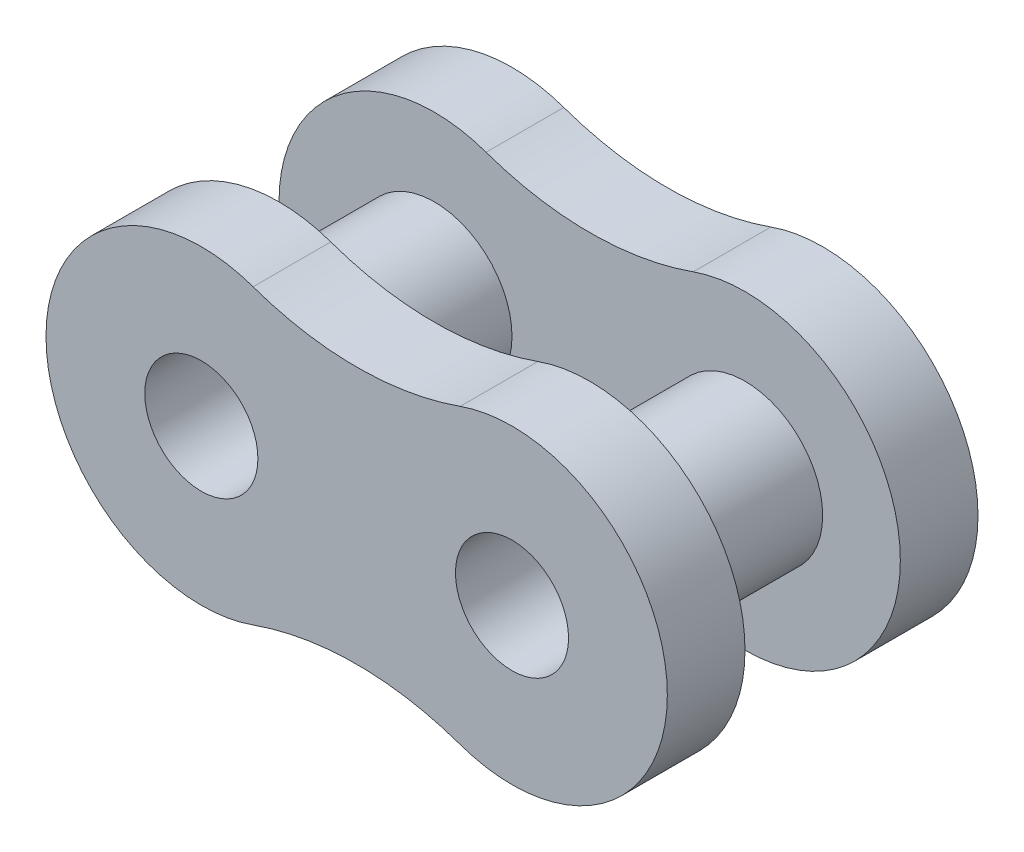
ISO-10303-21;
HEADER;
FILE_DESCRIPTION(('STEP AP214'),'2;1');
FILE_NAME('part.step','',(''),(''),'','','');
FILE_SCHEMA(('AUTOMOTIVE_DESIGN { 1 0 10303 214 1 1 1 1 }'));
ENDSEC;
DATA;
#1=APPLICATION_CONTEXT('core data for automotive mechanical design processes');
#2=APPLICATION_PROTOCOL_DEFINITION('international standard','automotive_design',2000,#1);
#3=PRODUCT_CONTEXT('',#1,'mechanical');
#4=PRODUCT('Part','Part','',(#3));
#5=PRODUCT_RELATED_PRODUCT_CATEGORY('part','',(#4));
#6=PRODUCT_DEFINITION_FORMATION('','',#4);
#7=PRODUCT_DEFINITION_CONTEXT('part definition',#1,'design');
#8=PRODUCT_DEFINITION('design','',#6,#7);
#9=PRODUCT_DEFINITION_SHAPE('','',#8);
#10=(LENGTH_UNIT() NAMED_UNIT(*) SI_UNIT(.MILLI.,.METRE.));
#11=(NAMED_UNIT(*) PLANE_ANGLE_UNIT() SI_UNIT($,.RADIAN.));
#12=(NAMED_UNIT(*) SI_UNIT($,.STERADIAN.) SOLID_ANGLE_UNIT());
#13=UNCERTAINTY_MEASURE_WITH_UNIT(LENGTH_MEASURE(1.E-05),#10,'distance_accuracy_value','');
#14=(GEOMETRIC_REPRESENTATION_CONTEXT(3) GLOBAL_UNCERTAINTY_ASSIGNED_CONTEXT((#13)) GLOBAL_UNIT_ASSIGNED_CONTEXT((#10,
#11,#12)) REPRESENTATION_CONTEXT('',''));
#15=CARTESIAN_POINT('',(0.,0.,0.));
#16=DIRECTION('',(0.,0.,1.));
#17=DIRECTION('',(1.,0.,0.));
#18=AXIS2_PLACEMENT_3D('',#15,#16,#17);
#19=CARTESIAN_POINT('',(3.175,-8.98025612106915,1.5875));
#20=DIRECTION('',(0.,0.,-1.));
#21=DIRECTION('',(-1.,0.,0.));
#22=AXIS2_PLACEMENT_3D('',#19,#20,#21);
#23=CYLINDRICAL_SURFACE('',#22,6.35);
#24=CARTESIAN_POINT('',(3.175,-8.98025612106915,0.));
#25=DIRECTION('',(0.,0.,1.));
#26=DIRECTION('',(1.,0.,0.));
#27=AXIS2_PLACEMENT_3D('',#24,#25,#26);
#28=CIRCLE('',#27,6.35);
#29=CARTESIAN_POINT('',(1.05833333333333,-2.99341870702305,0.));
#30=VERTEX_POINT('',#29);
#31=CARTESIAN_POINT('',(5.29166666666667,-2.99341870702305,0.));
#32=VERTEX_POINT('',#31);
#33=EDGE_CURVE('E270',#30,#32,#28,.F.);
#34=ORIENTED_EDGE('',*,*,#33,.T.);
#35=DIRECTION('',(0.,0.,-1.));
#36=VECTOR('',#35,1.);
#37=CARTESIAN_POINT('',(5.29166666666667,-2.99341870702305,1.5875));
#38=LINE('',#37,#36);
#39=CARTESIAN_POINT('',(5.29166666666667,-2.99341870702305,1.5875));
#40=VERTEX_POINT('',#39);
#41=EDGE_CURVE('E142',#40,#32,#38,.T.);
#42=ORIENTED_EDGE('',*,*,#41,.F.);
#43=CARTESIAN_POINT('',(3.175,-8.98025612106915,1.5875));
#44=DIRECTION('',(0.,0.,1.));
#45=DIRECTION('',(1.,0.,0.));
#46=AXIS2_PLACEMENT_3D('',#43,#44,#45);
#47=CIRCLE('',#46,6.35);
#48=CARTESIAN_POINT('',(1.05833333333333,-2.99341870702305,1.5875));
#49=VERTEX_POINT('',#48);
#50=EDGE_CURVE('E256',#49,#40,#47,.F.);
#51=ORIENTED_EDGE('',*,*,#50,.F.);
#52=DIRECTION('',(0.,0.,-1.));
#53=VECTOR('',#52,1.);
#54=CARTESIAN_POINT('',(1.05833333333333,-2.99341870702305,1.5875));
#55=LINE('',#54,#53);
#56=EDGE_CURVE('E12',#49,#30,#55,.T.);
#57=ORIENTED_EDGE('',*,*,#56,.T.);
#58=EDGE_LOOP('',(#34,#42,#51,#57));
#59=FACE_BOUND('',#58,.T.);
#60=ADVANCED_FACE('F131',(#59),#23,.F.);
#61=CARTESIAN_POINT('',(6.35,0.,1.5875));
#62=DIRECTION('',(0.,0.,-1.));
#63=DIRECTION('',(-1.,0.,0.));
#64=AXIS2_PLACEMENT_3D('',#61,#62,#63);
#65=CYLINDRICAL_SURFACE('',#64,3.175);
#66=CARTESIAN_POINT('',(6.35,0.,0.));
#67=DIRECTION('',(0.,0.,1.));
#68=DIRECTION('',(1.,0.,0.));
#69=AXIS2_PLACEMENT_3D('',#66,#67,#68);
#70=CIRCLE('',#69,3.175);
#71=CARTESIAN_POINT('',(5.29166666666667,2.99341870702305,0.));
#72=VERTEX_POINT('',#71);
#73=EDGE_CURVE('E275',#32,#72,#70,.T.);
#74=ORIENTED_EDGE('',*,*,#73,.T.);
#75=DIRECTION('',(0.,0.,-1.));
#76=VECTOR('',#75,1.);
#77=CARTESIAN_POINT('',(5.29166666666667,2.99341870702305,1.5875));
#78=LINE('',#77,#76);
#79=CARTESIAN_POINT('',(5.29166666666667,2.99341870702305,1.5875));
#80=VERTEX_POINT('',#79);
#81=EDGE_CURVE('E166',#80,#72,#78,.T.);
#82=ORIENTED_EDGE('',*,*,#81,.F.);
#83=CARTESIAN_POINT('',(6.35,0.,1.5875));
#84=DIRECTION('',(0.,0.,1.));
#85=DIRECTION('',(1.,0.,0.));
#86=AXIS2_PLACEMENT_3D('',#83,#84,#85);
#87=CIRCLE('',#86,3.175);
#88=EDGE_CURVE('E261',#40,#80,#87,.T.);
#89=ORIENTED_EDGE('',*,*,#88,.F.);
#90=ORIENTED_EDGE('',*,*,#41,.T.);
#91=EDGE_LOOP('',(#74,#82,#89,#90));
#92=FACE_BOUND('',#91,.T.);
#93=ADVANCED_FACE('F315',(#92),#65,.T.);
#94=CARTESIAN_POINT('',(3.175,8.98025612106915,1.5875));
#95=DIRECTION('',(0.,0.,-1.));
#96=DIRECTION('',(-1.,0.,0.));
#97=AXIS2_PLACEMENT_3D('',#94,#95,#96);
#98=CYLINDRICAL_SURFACE('',#97,6.35);
#99=CARTESIAN_POINT('',(3.175,8.98025612106915,0.));
#100=DIRECTION('',(0.,0.,1.));
#101=DIRECTION('',(1.,0.,0.));
#102=AXIS2_PLACEMENT_3D('',#99,#100,#101);
#103=CIRCLE('',#102,6.35);
#104=CARTESIAN_POINT('',(1.05833333333333,2.99341870702305,0.));
#105=VERTEX_POINT('',#104);
#106=EDGE_CURVE('E257',#105,#72,#103,.T.);
#107=ORIENTED_EDGE('',*,*,#106,.F.);
#108=DIRECTION('',(0.,0.,-1.));
#109=VECTOR('',#108,1.);
#110=CARTESIAN_POINT('',(1.05833333333333,2.99341870702305,1.5875));
#111=LINE('',#110,#109);
#112=CARTESIAN_POINT('',(1.05833333333333,2.99341870702305,1.5875));
#113=VERTEX_POINT('',#112);
#114=EDGE_CURVE('E151',#113,#105,#111,.T.);
#115=ORIENTED_EDGE('',*,*,#114,.F.);
#116=CARTESIAN_POINT('',(3.175,8.98025612106915,1.5875));
#117=DIRECTION('',(0.,0.,1.));
#118=DIRECTION('',(1.,0.,0.));
#119=AXIS2_PLACEMENT_3D('',#116,#117,#118);
#120=CIRCLE('',#119,6.35);
#121=EDGE_CURVE('E264',#113,#80,#120,.T.);
#122=ORIENTED_EDGE('',*,*,#121,.T.);
#123=ORIENTED_EDGE('',*,*,#81,.T.);
#124=EDGE_LOOP('',(#107,#115,#122,#123));
#125=FACE_BOUND('',#124,.T.);
#126=ADVANCED_FACE('F321',(#125),#98,.F.);
#127=CARTESIAN_POINT('',(0.,0.,1.5875));
#128=DIRECTION('',(0.,0.,-1.));
#129=DIRECTION('',(-1.,0.,0.));
#130=AXIS2_PLACEMENT_3D('',#127,#128,#129);
#131=CYLINDRICAL_SURFACE('',#130,3.175);
#132=CARTESIAN_POINT('',(0.,0.,0.));
#133=DIRECTION('',(0.,0.,1.));
#134=DIRECTION('',(1.,0.,0.));
#135=AXIS2_PLACEMENT_3D('',#132,#133,#134);
#136=CIRCLE('',#135,3.175);
#137=EDGE_CURVE('E267',#30,#105,#136,.F.);
#138=ORIENTED_EDGE('',*,*,#137,.F.);
#139=ORIENTED_EDGE('',*,*,#56,.F.);
#140=CARTESIAN_POINT('',(0.,0.,1.5875));
#141=DIRECTION('',(0.,0.,1.));
#142=DIRECTION('',(1.,0.,0.));
#143=AXIS2_PLACEMENT_3D('',#140,#141,#142);
#144=CIRCLE('',#143,3.175);
#145=EDGE_CURVE('E253',#49,#113,#144,.F.);
#146=ORIENTED_EDGE('',*,*,#145,.T.);
#147=ORIENTED_EDGE('',*,*,#114,.T.);
#148=EDGE_LOOP('',(#138,#139,#146,#147));
#149=FACE_BOUND('',#148,.T.);
#150=ADVANCED_FACE('F308',(#149),#131,.T.);
#151=CARTESIAN_POINT('',(0.,0.,0.));
#152=DIRECTION('',(0.,0.,1.));
#153=DIRECTION('',(1.,0.,0.));
#154=AXIS2_PLACEMENT_3D('',#151,#152,#153);
#155=PLANE('',#154);
#156=CARTESIAN_POINT('',(0.,0.,0.));
#157=DIRECTION('',(0.,0.,1.));
#158=DIRECTION('',(1.,0.,0.));
#159=AXIS2_PLACEMENT_3D('',#156,#157,#158);
#160=CIRCLE('',#159,1.5875);
#161=CARTESIAN_POINT('',(1.5875,0.,0.));
#162=VERTEX_POINT('',#161);
#163=EDGE_CURVE('E242',#162,#162,#160,.T.);
#164=ORIENTED_EDGE('',*,*,#163,.T.);
#165=EDGE_LOOP('',(#164));
#166=FACE_BOUND('',#165,.T.);
#167=CARTESIAN_POINT('',(6.35,0.,0.));
#168=DIRECTION('',(0.,0.,1.));
#169=DIRECTION('',(1.,0.,0.));
#170=AXIS2_PLACEMENT_3D('',#167,#168,#169);
#171=CIRCLE('',#170,1.5875);
#172=CARTESIAN_POINT('',(7.9375,0.,0.));
#173=VERTEX_POINT('',#172);
#174=EDGE_CURVE('E245',#173,#173,#171,.T.);
#175=ORIENTED_EDGE('',*,*,#174,.T.);
#176=EDGE_LOOP('',(#175));
#177=FACE_BOUND('',#176,.T.);
#178=ORIENTED_EDGE('',*,*,#137,.T.);
#179=ORIENTED_EDGE('',*,*,#106,.T.);
#180=ORIENTED_EDGE('',*,*,#73,.F.);
#181=ORIENTED_EDGE('',*,*,#33,.F.);
#182=EDGE_LOOP('',(#178,#179,#180,#181));
#183=FACE_BOUND('',#182,.T.);
#184=ADVANCED_FACE('F299',(#166,#177,#183),#155,.F.);
#185=CARTESIAN_POINT('',(0.,0.,1.5875));
#186=DIRECTION('',(0.,0.,1.));
#187=DIRECTION('',(1.,0.,0.));
#188=AXIS2_PLACEMENT_3D('',#185,#186,#187);
#189=PLANE('',#188);
#190=ORIENTED_EDGE('',*,*,#145,.F.);
#191=ORIENTED_EDGE('',*,*,#50,.T.);
#192=ORIENTED_EDGE('',*,*,#88,.T.);
#193=ORIENTED_EDGE('',*,*,#121,.F.);
#194=EDGE_LOOP('',(#190,#191,#192,#193));
#195=FACE_BOUND('',#194,.T.);
#196=CARTESIAN_POINT('',(6.35,0.,1.5875));
#197=DIRECTION('',(0.,0.,1.));
#198=DIRECTION('',(1.,0.,0.));
#199=AXIS2_PLACEMENT_3D('',#196,#197,#198);
#200=CIRCLE('',#199,1.1557);
#201=CARTESIAN_POINT('',(7.5057,0.,1.5875));
#202=VERTEX_POINT('',#201);
#203=EDGE_CURVE('E271',#202,#202,#200,.T.);
#204=ORIENTED_EDGE('',*,*,#203,.F.);
#205=EDGE_LOOP('',(#204));
#206=FACE_BOUND('',#205,.T.);
#207=CARTESIAN_POINT('',(0.,0.,1.5875));
#208=DIRECTION('',(0.,0.,1.));
#209=DIRECTION('',(1.,0.,0.));
#210=AXIS2_PLACEMENT_3D('',#207,#208,#209);
#211=CIRCLE('',#210,1.1557);
#212=CARTESIAN_POINT('',(1.1557,0.,1.5875));
#213=VERTEX_POINT('',#212);
#214=EDGE_CURVE('E135',#213,#213,#211,.T.);
#215=ORIENTED_EDGE('',*,*,#214,.F.);
#216=EDGE_LOOP('',(#215));
#217=FACE_BOUND('',#216,.T.);
#218=ADVANCED_FACE('F297',(#195,#206,#217),#189,.T.);
#219=CARTESIAN_POINT('',(0.,0.,1.5875));
#220=DIRECTION('',(0.,0.,-1.));
#221=DIRECTION('',(-1.,0.,0.));
#222=AXIS2_PLACEMENT_3D('',#219,#220,#221);
#223=CYLINDRICAL_SURFACE('',#222,1.1557);
#224=ORIENTED_EDGE('',*,*,#214,.T.);
#225=EDGE_LOOP('',(#224));
#226=FACE_BOUND('',#225,.T.);
#227=CARTESIAN_POINT('',(0.,0.,-4.7625));
#228=DIRECTION('',(0.,0.,-1.));
#229=DIRECTION('',(-1.,0.,0.));
#230=AXIS2_PLACEMENT_3D('',#227,#228,#229);
#231=CIRCLE('',#230,1.1557);
#232=CARTESIAN_POINT('',(-1.1557,0.,-4.7625));
#233=VERTEX_POINT('',#232);
#234=EDGE_CURVE('E340',#233,#233,#231,.T.);
#235=ORIENTED_EDGE('',*,*,#234,.T.);
#236=EDGE_LOOP('',(#235));
#237=FACE_BOUND('',#236,.T.);
#238=ADVANCED_FACE('F133',(#226,#237),#223,.F.);
#239=CARTESIAN_POINT('',(6.35,0.,1.5875));
#240=DIRECTION('',(0.,0.,-1.));
#241=DIRECTION('',(-1.,0.,0.));
#242=AXIS2_PLACEMENT_3D('',#239,#240,#241);
#243=CYLINDRICAL_SURFACE('',#242,1.1557);
#244=ORIENTED_EDGE('',*,*,#203,.T.);
#245=EDGE_LOOP('',(#244));
#246=FACE_BOUND('',#245,.T.);
#247=CARTESIAN_POINT('',(6.35,0.,-4.7625));
#248=DIRECTION('',(0.,0.,-1.));
#249=DIRECTION('',(-1.,0.,0.));
#250=AXIS2_PLACEMENT_3D('',#247,#248,#249);
#251=CIRCLE('',#250,1.1557);
#252=CARTESIAN_POINT('',(5.1943,0.,-4.7625));
#253=VERTEX_POINT('',#252);
#254=EDGE_CURVE('E337',#253,#253,#251,.T.);
#255=ORIENTED_EDGE('',*,*,#254,.T.);
#256=EDGE_LOOP('',(#255));
#257=FACE_BOUND('',#256,.T.);
#258=ADVANCED_FACE('F307',(#246,#257),#243,.F.);
#259=CARTESIAN_POINT('',(6.35,0.,-3.175));
#260=DIRECTION('',(0.,0.,1.));
#261=DIRECTION('',(1.,0.,0.));
#262=AXIS2_PLACEMENT_3D('',#259,#260,#261);
#263=CYLINDRICAL_SURFACE('',#262,1.5875);
#264=CARTESIAN_POINT('',(6.35,0.,-3.175));
#265=DIRECTION('',(0.,0.,1.));
#266=DIRECTION('',(1.,0.,0.));
#267=AXIS2_PLACEMENT_3D('',#264,#265,#266);
#268=CIRCLE('',#267,1.5875);
#269=CARTESIAN_POINT('',(7.9375,0.,-3.175));
#270=VERTEX_POINT('',#269);
#271=EDGE_CURVE('E236',#270,#270,#268,.T.);
#272=ORIENTED_EDGE('',*,*,#271,.T.);
#273=EDGE_LOOP('',(#272));
#274=FACE_BOUND('',#273,.T.);
#275=ORIENTED_EDGE('',*,*,#174,.F.);
#276=EDGE_LOOP('',(#275));
#277=FACE_BOUND('',#276,.T.);
#278=ADVANCED_FACE('F327',(#274,#277),#263,.T.);
#279=CARTESIAN_POINT('',(0.,0.,-3.175));
#280=DIRECTION('',(0.,0.,1.));
#281=DIRECTION('',(1.,0.,0.));
#282=AXIS2_PLACEMENT_3D('',#279,#280,#281);
#283=CYLINDRICAL_SURFACE('',#282,1.5875);
#284=CARTESIAN_POINT('',(0.,0.,-3.175));
#285=DIRECTION('',(0.,0.,1.));
#286=DIRECTION('',(1.,0.,0.));
#287=AXIS2_PLACEMENT_3D('',#284,#285,#286);
#288=CIRCLE('',#287,1.5875);
#289=CARTESIAN_POINT('',(1.5875,0.,-3.175));
#290=VERTEX_POINT('',#289);
#291=EDGE_CURVE('E231',#290,#290,#288,.T.);
#292=ORIENTED_EDGE('',*,*,#291,.T.);
#293=EDGE_LOOP('',(#292));
#294=FACE_BOUND('',#293,.T.);
#295=ORIENTED_EDGE('',*,*,#163,.F.);
#296=EDGE_LOOP('',(#295));
#297=FACE_BOUND('',#296,.T.);
#298=ADVANCED_FACE('F332',(#294,#297),#283,.T.);
#299=CARTESIAN_POINT('',(1.5875,4.4901280605346,-4.7625));
#300=DIRECTION('',(0.,0.,-1.));
#301=DIRECTION('',(-1.,0.,0.));
#302=AXIS2_PLACEMENT_3D('',#299,#300,#301);
#303=PLANE('',#302);
#304=ORIENTED_EDGE('',*,*,#254,.F.);
#305=EDGE_LOOP('',(#304));
#306=FACE_BOUND('',#305,.T.);
#307=CARTESIAN_POINT('',(3.175,8.98025612106919,-4.7625));
#308=DIRECTION('',(0.,0.,1.));
#309=DIRECTION('',(-1.,0.,0.));
#310=AXIS2_PLACEMENT_3D('',#307,#308,#309);
#311=CIRCLE('',#310,6.35000000000004);
#312=CARTESIAN_POINT('',(1.05833333333333,2.99341870702305,-4.7625));
#313=VERTEX_POINT('',#312);
#314=CARTESIAN_POINT('',(5.29166666666667,2.99341870702305,-4.7625));
#315=VERTEX_POINT('',#314);
#316=EDGE_CURVE('E214',#313,#315,#311,.T.);
#317=ORIENTED_EDGE('',*,*,#316,.T.);
#318=CARTESIAN_POINT('',(6.35,0.,-4.7625));
#319=DIRECTION('',(0.,0.,-1.));
#320=DIRECTION('',(-1.,0.,0.));
#321=AXIS2_PLACEMENT_3D('',#318,#319,#320);
#322=CIRCLE('',#321,3.175);
#323=CARTESIAN_POINT('',(5.29166666666667,-2.99341870702305,-4.7625));
#324=VERTEX_POINT('',#323);
#325=EDGE_CURVE('E202',#315,#324,#322,.T.);
#326=ORIENTED_EDGE('',*,*,#325,.T.);
#327=CARTESIAN_POINT('',(3.175,-8.98025612106919,-4.7625));
#328=DIRECTION('',(0.,0.,1.));
#329=DIRECTION('',(-1.,0.,0.));
#330=AXIS2_PLACEMENT_3D('',#327,#328,#329);
#331=CIRCLE('',#330,6.35000000000003);
#332=CARTESIAN_POINT('',(1.05833333333333,-2.99341870702305,-4.7625));
#333=VERTEX_POINT('',#332);
#334=EDGE_CURVE('E213',#324,#333,#331,.T.);
#335=ORIENTED_EDGE('',*,*,#334,.T.);
#336=CARTESIAN_POINT('',(0.,0.,-4.7625));
#337=DIRECTION('',(0.,0.,-1.));
#338=DIRECTION('',(1.,0.,0.));
#339=AXIS2_PLACEMENT_3D('',#336,#337,#338);
#340=CIRCLE('',#339,3.175);
#341=EDGE_CURVE('E220',#333,#313,#340,.T.);
#342=ORIENTED_EDGE('',*,*,#341,.T.);
#343=EDGE_LOOP('',(#317,#326,#335,#342));
#344=FACE_BOUND('',#343,.T.);
#345=ORIENTED_EDGE('',*,*,#234,.F.);
#346=EDGE_LOOP('',(#345));
#347=FACE_BOUND('',#346,.T.);
#348=ADVANCED_FACE('F217',(#306,#344,#347),#303,.T.);
#349=CARTESIAN_POINT('',(1.5875,4.4901280605346,-3.175));
#350=DIRECTION('',(0.,0.,-1.));
#351=DIRECTION('',(-1.,0.,0.));
#352=AXIS2_PLACEMENT_3D('',#349,#350,#351);
#353=PLANE('',#352);
#354=ORIENTED_EDGE('',*,*,#271,.F.);
#355=EDGE_LOOP('',(#354));
#356=FACE_BOUND('',#355,.T.);
#357=ORIENTED_EDGE('',*,*,#291,.F.);
#358=EDGE_LOOP('',(#357));
#359=FACE_BOUND('',#358,.T.);
#360=CARTESIAN_POINT('',(3.175,8.98025612106919,-3.175));
#361=DIRECTION('',(0.,0.,1.));
#362=DIRECTION('',(-1.,0.,0.));
#363=AXIS2_PLACEMENT_3D('',#360,#361,#362);
#364=CIRCLE('',#363,6.35000000000004);
#365=CARTESIAN_POINT('',(1.05833333333333,2.99341870702305,-3.175));
#366=VERTEX_POINT('',#365);
#367=CARTESIAN_POINT('',(5.29166666666667,2.99341870702305,-3.175));
#368=VERTEX_POINT('',#367);
#369=EDGE_CURVE('E229',#366,#368,#364,.T.);
#370=ORIENTED_EDGE('',*,*,#369,.F.);
#371=CARTESIAN_POINT('',(0.,0.,-3.175));
#372=DIRECTION('',(0.,0.,-1.));
#373=DIRECTION('',(1.,0.,0.));
#374=AXIS2_PLACEMENT_3D('',#371,#372,#373);
#375=CIRCLE('',#374,3.175);
#376=CARTESIAN_POINT('',(1.05833333333333,-2.99341870702305,-3.175));
#377=VERTEX_POINT('',#376);
#378=EDGE_CURVE('E225',#377,#366,#375,.T.);
#379=ORIENTED_EDGE('',*,*,#378,.F.);
#380=CARTESIAN_POINT('',(3.175,-8.98025612106919,-3.175));
#381=DIRECTION('',(0.,0.,1.));
#382=DIRECTION('',(-1.,0.,0.));
#383=AXIS2_PLACEMENT_3D('',#380,#381,#382);
#384=CIRCLE('',#383,6.35000000000003);
#385=CARTESIAN_POINT('',(5.29166666666667,-2.99341870702305,-3.175));
#386=VERTEX_POINT('',#385);
#387=EDGE_CURVE('E356',#386,#377,#384,.T.);
#388=ORIENTED_EDGE('',*,*,#387,.F.);
#389=CARTESIAN_POINT('',(6.35,0.,-3.175));
#390=DIRECTION('',(0.,0.,-1.));
#391=DIRECTION('',(-1.,0.,0.));
#392=AXIS2_PLACEMENT_3D('',#389,#390,#391);
#393=CIRCLE('',#392,3.175);
#394=EDGE_CURVE('E344',#368,#386,#393,.T.);
#395=ORIENTED_EDGE('',*,*,#394,.F.);
#396=EDGE_LOOP('',(#370,#379,#388,#395));
#397=FACE_BOUND('',#396,.T.);
#398=ADVANCED_FACE('F371',(#356,#359,#397),#353,.F.);
#399=CARTESIAN_POINT('',(3.175,8.98025612106919,-4.7625));
#400=DIRECTION('',(0.,0.,1.));
#401=DIRECTION('',(1.,0.,0.));
#402=AXIS2_PLACEMENT_3D('',#399,#400,#401);
#403=CYLINDRICAL_SURFACE('',#402,6.35000000000004);
#404=ORIENTED_EDGE('',*,*,#369,.T.);
#405=DIRECTION('',(0.,0.,1.));
#406=VECTOR('',#405,1.);
#407=CARTESIAN_POINT('',(5.29166666666667,2.99341870702305,-4.7625));
#408=LINE('',#407,#406);
#409=EDGE_CURVE('E206',#315,#368,#408,.T.);
#410=ORIENTED_EDGE('',*,*,#409,.F.);
#411=ORIENTED_EDGE('',*,*,#316,.F.);
#412=DIRECTION('',(0.,0.,1.));
#413=VECTOR('',#412,1.);
#414=CARTESIAN_POINT('',(1.05833333333333,2.99341870702305,-4.7625));
#415=LINE('',#414,#413);
#416=EDGE_CURVE('E352',#313,#366,#415,.T.);
#417=ORIENTED_EDGE('',*,*,#416,.T.);
#418=EDGE_LOOP('',(#404,#410,#411,#417));
#419=FACE_BOUND('',#418,.T.);
#420=ADVANCED_FACE('F227',(#419),#403,.F.);
#421=CARTESIAN_POINT('',(6.35,0.,-4.7625));
#422=DIRECTION('',(0.,0.,1.));
#423=DIRECTION('',(1.,0.,0.));
#424=AXIS2_PLACEMENT_3D('',#421,#422,#423);
#425=CYLINDRICAL_SURFACE('',#424,3.175);
#426=ORIENTED_EDGE('',*,*,#394,.T.);
#427=DIRECTION('',(0.,0.,1.));
#428=VECTOR('',#427,1.);
#429=CARTESIAN_POINT('',(5.29166666666667,-2.99341870702305,-4.7625));
#430=LINE('',#429,#428);
#431=EDGE_CURVE('E209',#324,#386,#430,.T.);
#432=ORIENTED_EDGE('',*,*,#431,.F.);
#433=ORIENTED_EDGE('',*,*,#325,.F.);
#434=ORIENTED_EDGE('',*,*,#409,.T.);
#435=EDGE_LOOP('',(#426,#432,#433,#434));
#436=FACE_BOUND('',#435,.T.);
#437=ADVANCED_FACE('F204',(#436),#425,.T.);
#438=CARTESIAN_POINT('',(3.175,-8.98025612106919,-4.7625));
#439=DIRECTION('',(0.,0.,1.));
#440=DIRECTION('',(1.,0.,0.));
#441=AXIS2_PLACEMENT_3D('',#438,#439,#440);
#442=CYLINDRICAL_SURFACE('',#441,6.35000000000003);
#443=ORIENTED_EDGE('',*,*,#387,.T.);
#444=DIRECTION('',(0.,0.,1.));
#445=VECTOR('',#444,1.);
#446=CARTESIAN_POINT('',(1.05833333333333,-2.99341870702305,-4.7625));
#447=LINE('',#446,#445);
#448=EDGE_CURVE('E238',#333,#377,#447,.T.);
#449=ORIENTED_EDGE('',*,*,#448,.F.);
#450=ORIENTED_EDGE('',*,*,#334,.F.);
#451=ORIENTED_EDGE('',*,*,#431,.T.);
#452=EDGE_LOOP('',(#443,#449,#450,#451));
#453=FACE_BOUND('',#452,.T.);
#454=ADVANCED_FACE('F372',(#453),#442,.F.);
#455=CARTESIAN_POINT('',(0.,0.,-4.7625));
#456=DIRECTION('',(0.,0.,1.));
#457=DIRECTION('',(1.,0.,0.));
#458=AXIS2_PLACEMENT_3D('',#455,#456,#457);
#459=CYLINDRICAL_SURFACE('',#458,3.175);
#460=ORIENTED_EDGE('',*,*,#378,.T.);
#461=ORIENTED_EDGE('',*,*,#416,.F.);
#462=ORIENTED_EDGE('',*,*,#341,.F.);
#463=ORIENTED_EDGE('',*,*,#448,.T.);
#464=EDGE_LOOP('',(#460,#461,#462,#463));
#465=FACE_BOUND('',#464,.T.);
#466=ADVANCED_FACE('F367',(#465),#459,.T.);
#467=CLOSED_SHELL('',(#60,#93,#126,#150,#184,#218,#238,#258,#278,#298,#348,#398,#420,#437,#454,#466));
#468=MANIFOLD_SOLID_BREP('B2',#467);
#469=ADVANCED_BREP_SHAPE_REPRESENTATION('',(#18,#468),#14);
#470=SHAPE_DEFINITION_REPRESENTATION(#9,#469);
ENDSEC;
END-ISO-10303-21;
